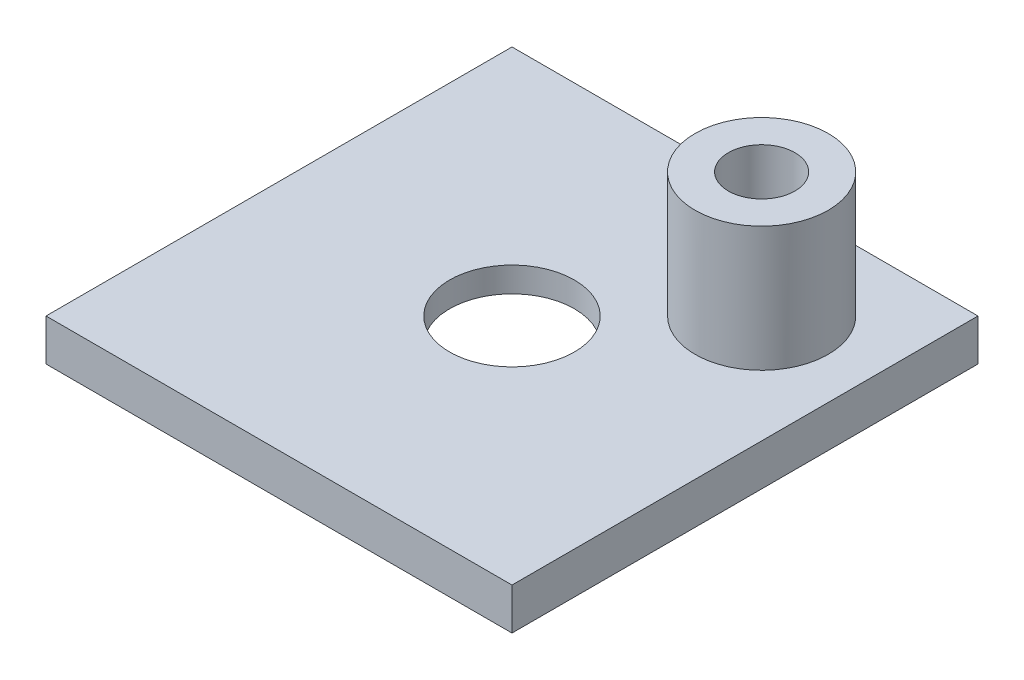
ISO-10303-21;
HEADER;
FILE_DESCRIPTION(('STEP AP214'),'2;1');
FILE_NAME('part.step','',(''),(''),'','','');
FILE_SCHEMA(('AUTOMOTIVE_DESIGN { 1 0 10303 214 1 1 1 1 }'));
ENDSEC;
DATA;
#1=APPLICATION_CONTEXT('core data for automotive mechanical design processes');
#2=APPLICATION_PROTOCOL_DEFINITION('international standard','automotive_design',2000,#1);
#3=PRODUCT_CONTEXT('',#1,'mechanical');
#4=PRODUCT('Part','Part','',(#3));
#5=PRODUCT_RELATED_PRODUCT_CATEGORY('part','',(#4));
#6=PRODUCT_DEFINITION_FORMATION('','',#4);
#7=PRODUCT_DEFINITION_CONTEXT('part definition',#1,'design');
#8=PRODUCT_DEFINITION('design','',#6,#7);
#9=PRODUCT_DEFINITION_SHAPE('','',#8);
#10=(LENGTH_UNIT() NAMED_UNIT(*) SI_UNIT(.MILLI.,.METRE.));
#11=(NAMED_UNIT(*) PLANE_ANGLE_UNIT() SI_UNIT($,.RADIAN.));
#12=(NAMED_UNIT(*) SI_UNIT($,.STERADIAN.) SOLID_ANGLE_UNIT());
#13=UNCERTAINTY_MEASURE_WITH_UNIT(LENGTH_MEASURE(1.E-05),#10,'distance_accuracy_value','');
#14=(GEOMETRIC_REPRESENTATION_CONTEXT(3) GLOBAL_UNCERTAINTY_ASSIGNED_CONTEXT((#13)) GLOBAL_UNIT_ASSIGNED_CONTEXT((#10,
#11,#12)) REPRESENTATION_CONTEXT('',''));
#15=CARTESIAN_POINT('',(0.,0.,0.));
#16=DIRECTION('',(0.,0.,1.));
#17=DIRECTION('',(1.,0.,0.));
#18=AXIS2_PLACEMENT_3D('',#15,#16,#17);
#19=CARTESIAN_POINT('',(28.,5.,28.));
#20=DIRECTION('',(-1.,0.,0.));
#21=DIRECTION('',(0.,0.,1.));
#22=AXIS2_PLACEMENT_3D('',#19,#20,#21);
#23=PLANE('',#22);
#24=DIRECTION('',(0.,0.,-1.));
#25=VECTOR('',#24,1.);
#26=CARTESIAN_POINT('',(28.,0.,28.));
#27=LINE('',#26,#25);
#28=CARTESIAN_POINT('',(28.,0.,28.));
#29=VERTEX_POINT('',#28);
#30=CARTESIAN_POINT('',(28.,0.,-28.));
#31=VERTEX_POINT('',#30);
#32=EDGE_CURVE('E111',#29,#31,#27,.T.);
#33=ORIENTED_EDGE('',*,*,#32,.T.);
#34=DIRECTION('',(0.,-1.,0.));
#35=VECTOR('',#34,1.);
#36=CARTESIAN_POINT('',(28.,5.,-28.));
#37=LINE('',#36,#35);
#38=CARTESIAN_POINT('',(28.,5.,-28.));
#39=VERTEX_POINT('',#38);
#40=EDGE_CURVE('E49',#39,#31,#37,.T.);
#41=ORIENTED_EDGE('',*,*,#40,.F.);
#42=DIRECTION('',(0.,0.,-1.));
#43=VECTOR('',#42,1.);
#44=CARTESIAN_POINT('',(28.,5.,28.));
#45=LINE('',#44,#43);
#46=CARTESIAN_POINT('',(28.,5.,28.));
#47=VERTEX_POINT('',#46);
#48=EDGE_CURVE('E93',#47,#39,#45,.T.);
#49=ORIENTED_EDGE('',*,*,#48,.F.);
#50=DIRECTION('',(0.,-1.,0.));
#51=VECTOR('',#50,1.);
#52=CARTESIAN_POINT('',(28.,5.,28.));
#53=LINE('',#52,#51);
#54=EDGE_CURVE('E107',#47,#29,#53,.T.);
#55=ORIENTED_EDGE('',*,*,#54,.T.);
#56=EDGE_LOOP('',(#33,#41,#49,#55));
#57=FACE_BOUND('',#56,.T.);
#58=ADVANCED_FACE('F39',(#57),#23,.F.);
#59=CARTESIAN_POINT('',(-28.,5.,-28.));
#60=DIRECTION('',(0.,0.,1.));
#61=DIRECTION('',(1.,0.,0.));
#62=AXIS2_PLACEMENT_3D('',#59,#60,#61);
#63=PLANE('',#62);
#64=DIRECTION('',(-1.,0.,0.));
#65=VECTOR('',#64,1.);
#66=CARTESIAN_POINT('',(-28.,0.,-28.));
#67=LINE('',#66,#65);
#68=CARTESIAN_POINT('',(-28.,0.,-28.));
#69=VERTEX_POINT('',#68);
#70=EDGE_CURVE('E99',#31,#69,#67,.T.);
#71=ORIENTED_EDGE('',*,*,#70,.T.);
#72=DIRECTION('',(0.,-1.,0.));
#73=VECTOR('',#72,1.);
#74=CARTESIAN_POINT('',(-28.,5.,-28.));
#75=LINE('',#74,#73);
#76=CARTESIAN_POINT('',(-28.,5.,-28.));
#77=VERTEX_POINT('',#76);
#78=EDGE_CURVE('E97',#77,#69,#75,.T.);
#79=ORIENTED_EDGE('',*,*,#78,.F.);
#80=DIRECTION('',(-1.,0.,0.));
#81=VECTOR('',#80,1.);
#82=CARTESIAN_POINT('',(-28.,5.,-28.));
#83=LINE('',#82,#81);
#84=EDGE_CURVE('E88',#39,#77,#83,.T.);
#85=ORIENTED_EDGE('',*,*,#84,.F.);
#86=ORIENTED_EDGE('',*,*,#40,.T.);
#87=EDGE_LOOP('',(#71,#79,#85,#86));
#88=FACE_BOUND('',#87,.T.);
#89=ADVANCED_FACE('F98',(#88),#63,.F.);
#90=CARTESIAN_POINT('',(-28.,5.,28.));
#91=DIRECTION('',(1.,0.,0.));
#92=DIRECTION('',(0.,0.,-1.));
#93=AXIS2_PLACEMENT_3D('',#90,#91,#92);
#94=PLANE('',#93);
#95=DIRECTION('',(0.,0.,1.));
#96=VECTOR('',#95,1.);
#97=CARTESIAN_POINT('',(-28.,0.,28.));
#98=LINE('',#97,#96);
#99=CARTESIAN_POINT('',(-28.,0.,28.));
#100=VERTEX_POINT('',#99);
#101=EDGE_CURVE('E74',#69,#100,#98,.T.);
#102=ORIENTED_EDGE('',*,*,#101,.T.);
#103=DIRECTION('',(0.,-1.,0.));
#104=VECTOR('',#103,1.);
#105=CARTESIAN_POINT('',(-28.,5.,28.));
#106=LINE('',#105,#104);
#107=CARTESIAN_POINT('',(-28.,5.,28.));
#108=VERTEX_POINT('',#107);
#109=EDGE_CURVE('E101',#108,#100,#106,.T.);
#110=ORIENTED_EDGE('',*,*,#109,.F.);
#111=DIRECTION('',(0.,0.,1.));
#112=VECTOR('',#111,1.);
#113=CARTESIAN_POINT('',(-28.,5.,28.));
#114=LINE('',#113,#112);
#115=EDGE_CURVE('E91',#77,#108,#114,.T.);
#116=ORIENTED_EDGE('',*,*,#115,.F.);
#117=ORIENTED_EDGE('',*,*,#78,.T.);
#118=EDGE_LOOP('',(#102,#110,#116,#117));
#119=FACE_BOUND('',#118,.T.);
#120=ADVANCED_FACE('F103',(#119),#94,.F.);
#121=CARTESIAN_POINT('',(-28.,5.,28.));
#122=DIRECTION('',(0.,0.,-1.));
#123=DIRECTION('',(-1.,0.,0.));
#124=AXIS2_PLACEMENT_3D('',#121,#122,#123);
#125=PLANE('',#124);
#126=DIRECTION('',(1.,0.,0.));
#127=VECTOR('',#126,1.);
#128=CARTESIAN_POINT('',(-28.,0.,28.));
#129=LINE('',#128,#127);
#130=EDGE_CURVE('E80',#100,#29,#129,.T.);
#131=ORIENTED_EDGE('',*,*,#130,.T.);
#132=ORIENTED_EDGE('',*,*,#54,.F.);
#133=DIRECTION('',(1.,0.,0.));
#134=VECTOR('',#133,1.);
#135=CARTESIAN_POINT('',(-28.,5.,28.));
#136=LINE('',#135,#134);
#137=EDGE_CURVE('E57',#108,#47,#136,.T.);
#138=ORIENTED_EDGE('',*,*,#137,.F.);
#139=ORIENTED_EDGE('',*,*,#109,.T.);
#140=EDGE_LOOP('',(#131,#132,#138,#139));
#141=FACE_BOUND('',#140,.T.);
#142=ADVANCED_FACE('F142',(#141),#125,.F.);
#143=CARTESIAN_POINT('',(0.,5.,0.));
#144=DIRECTION('',(0.,-1.,0.));
#145=DIRECTION('',(0.,0.,-1.));
#146=AXIS2_PLACEMENT_3D('',#143,#144,#145);
#147=PLANE('',#146);
#148=CARTESIAN_POINT('',(0.,5.,0.));
#149=DIRECTION('',(0.,-1.,0.));
#150=DIRECTION('',(0.,0.,-1.));
#151=AXIS2_PLACEMENT_3D('',#148,#149,#150);
#152=CIRCLE('',#151,7.5);
#153=CARTESIAN_POINT('',(0.,5.,-7.5));
#154=VERTEX_POINT('',#153);
#155=EDGE_CURVE('E237',#154,#154,#152,.T.);
#156=ORIENTED_EDGE('',*,*,#155,.T.);
#157=EDGE_LOOP('',(#156));
#158=FACE_BOUND('',#157,.T.);
#159=CARTESIAN_POINT('',(15.,5.,-15.));
#160=DIRECTION('',(0.,-1.,0.));
#161=DIRECTION('',(0.,0.,-1.));
#162=AXIS2_PLACEMENT_3D('',#159,#160,#161);
#163=CIRCLE('',#162,8.);
#164=CARTESIAN_POINT('',(15.,5.,-23.));
#165=VERTEX_POINT('',#164);
#166=EDGE_CURVE('E11',#165,#165,#163,.F.);
#167=ORIENTED_EDGE('',*,*,#166,.F.);
#168=EDGE_LOOP('',(#167));
#169=FACE_BOUND('',#168,.T.);
#170=ORIENTED_EDGE('',*,*,#48,.T.);
#171=ORIENTED_EDGE('',*,*,#84,.T.);
#172=ORIENTED_EDGE('',*,*,#115,.T.);
#173=ORIENTED_EDGE('',*,*,#137,.T.);
#174=EDGE_LOOP('',(#170,#171,#172,#173));
#175=FACE_BOUND('',#174,.T.);
#176=ADVANCED_FACE('F89',(#158,#169,#175),#147,.F.);
#177=CARTESIAN_POINT('',(0.,0.,0.));
#178=DIRECTION('',(0.,-1.,0.));
#179=DIRECTION('',(0.,0.,-1.));
#180=AXIS2_PLACEMENT_3D('',#177,#178,#179);
#181=PLANE('',#180);
#182=CARTESIAN_POINT('',(0.,0.,0.));
#183=DIRECTION('',(0.,-1.,0.));
#184=DIRECTION('',(0.,0.,-1.));
#185=AXIS2_PLACEMENT_3D('',#182,#183,#184);
#186=CIRCLE('',#185,19.);
#187=CARTESIAN_POINT('',(0.,0.,-19.));
#188=VERTEX_POINT('',#187);
#189=EDGE_CURVE('E235',#188,#188,#186,.T.);
#190=ORIENTED_EDGE('',*,*,#189,.F.);
#191=EDGE_LOOP('',(#190));
#192=FACE_BOUND('',#191,.T.);
#193=ORIENTED_EDGE('',*,*,#32,.F.);
#194=ORIENTED_EDGE('',*,*,#130,.F.);
#195=ORIENTED_EDGE('',*,*,#101,.F.);
#196=ORIENTED_EDGE('',*,*,#70,.F.);
#197=EDGE_LOOP('',(#193,#194,#195,#196));
#198=FACE_BOUND('',#197,.T.);
#199=ADVANCED_FACE('F130',(#192,#198),#181,.T.);
#200=CARTESIAN_POINT('',(15.,20.,-15.));
#201=DIRECTION('',(0.,-1.,0.));
#202=DIRECTION('',(0.,0.,-1.));
#203=AXIS2_PLACEMENT_3D('',#200,#201,#202);
#204=CYLINDRICAL_SURFACE('',#203,8.);
#205=CARTESIAN_POINT('',(15.,20.,-15.));
#206=DIRECTION('',(0.,1.,0.));
#207=DIRECTION('',(0.,0.,1.));
#208=AXIS2_PLACEMENT_3D('',#205,#206,#207);
#209=CIRCLE('',#208,8.);
#210=CARTESIAN_POINT('',(15.,20.,-7.));
#211=VERTEX_POINT('',#210);
#212=EDGE_CURVE('E115',#211,#211,#209,.T.);
#213=ORIENTED_EDGE('',*,*,#212,.F.);
#214=EDGE_LOOP('',(#213));
#215=FACE_BOUND('',#214,.T.);
#216=ORIENTED_EDGE('',*,*,#166,.T.);
#217=EDGE_LOOP('',(#216));
#218=FACE_BOUND('',#217,.T.);
#219=ADVANCED_FACE('F132',(#215,#218),#204,.T.);
#220=CARTESIAN_POINT('',(15.,20.,-15.));
#221=DIRECTION('',(0.,1.,0.));
#222=DIRECTION('',(0.,0.,1.));
#223=AXIS2_PLACEMENT_3D('',#220,#221,#222);
#224=PLANE('',#223);
#225=CARTESIAN_POINT('',(15.,20.,-15.));
#226=DIRECTION('',(0.,1.,0.));
#227=DIRECTION('',(0.,0.,1.));
#228=AXIS2_PLACEMENT_3D('',#225,#226,#227);
#229=CIRCLE('',#228,4.);
#230=CARTESIAN_POINT('',(15.,20.,-11.));
#231=VERTEX_POINT('',#230);
#232=EDGE_CURVE('E258',#231,#231,#229,.T.);
#233=ORIENTED_EDGE('',*,*,#232,.F.);
#234=EDGE_LOOP('',(#233));
#235=FACE_BOUND('',#234,.T.);
#236=ORIENTED_EDGE('',*,*,#212,.T.);
#237=EDGE_LOOP('',(#236));
#238=FACE_BOUND('',#237,.T.);
#239=ADVANCED_FACE('F139',(#235,#238),#224,.T.);
#240=CARTESIAN_POINT('',(0.,2.,0.));
#241=DIRECTION('',(0.,-1.,0.));
#242=DIRECTION('',(0.,0.,-1.));
#243=AXIS2_PLACEMENT_3D('',#240,#241,#242);
#244=CYLINDRICAL_SURFACE('',#243,19.);
#245=CARTESIAN_POINT('',(0.,2.,0.));
#246=DIRECTION('',(0.,-1.,0.));
#247=DIRECTION('',(0.,0.,-1.));
#248=AXIS2_PLACEMENT_3D('',#245,#246,#247);
#249=CIRCLE('',#248,19.);
#250=CARTESIAN_POINT('',(0.,2.,-19.));
#251=VERTEX_POINT('',#250);
#252=EDGE_CURVE('E233',#251,#251,#249,.T.);
#253=ORIENTED_EDGE('',*,*,#252,.F.);
#254=EDGE_LOOP('',(#253));
#255=FACE_BOUND('',#254,.T.);
#256=ORIENTED_EDGE('',*,*,#189,.T.);
#257=EDGE_LOOP('',(#256));
#258=FACE_BOUND('',#257,.T.);
#259=ADVANCED_FACE('F172',(#255,#258),#244,.F.);
#260=CARTESIAN_POINT('',(0.,2.,0.));
#261=DIRECTION('',(0.,-1.,0.));
#262=DIRECTION('',(0.,0.,-1.));
#263=AXIS2_PLACEMENT_3D('',#260,#261,#262);
#264=PLANE('',#263);
#265=CARTESIAN_POINT('',(0.,2.,0.));
#266=DIRECTION('',(0.,-1.,0.));
#267=DIRECTION('',(0.,0.,-1.));
#268=AXIS2_PLACEMENT_3D('',#265,#266,#267);
#269=CIRCLE('',#268,7.5);
#270=CARTESIAN_POINT('',(0.,2.,-7.5));
#271=VERTEX_POINT('',#270);
#272=EDGE_CURVE('E42',#271,#271,#269,.T.);
#273=ORIENTED_EDGE('',*,*,#272,.F.);
#274=EDGE_LOOP('',(#273));
#275=FACE_BOUND('',#274,.T.);
#276=ORIENTED_EDGE('',*,*,#252,.T.);
#277=EDGE_LOOP('',(#276));
#278=FACE_BOUND('',#277,.T.);
#279=ADVANCED_FACE('F176',(#275,#278),#264,.T.);
#280=CARTESIAN_POINT('',(0.,20.,0.));
#281=DIRECTION('',(0.,-1.,0.));
#282=DIRECTION('',(0.,0.,-1.));
#283=AXIS2_PLACEMENT_3D('',#280,#281,#282);
#284=CYLINDRICAL_SURFACE('',#283,7.5);
#285=ORIENTED_EDGE('',*,*,#272,.T.);
#286=EDGE_LOOP('',(#285));
#287=FACE_BOUND('',#286,.T.);
#288=ORIENTED_EDGE('',*,*,#155,.F.);
#289=EDGE_LOOP('',(#288));
#290=FACE_BOUND('',#289,.T.);
#291=ADVANCED_FACE('F181',(#287,#290),#284,.F.);
#292=CARTESIAN_POINT('',(0.,5.,0.));
#293=DIRECTION('',(0.,-1.,0.));
#294=DIRECTION('',(0.,0.,-1.));
#295=AXIS2_PLACEMENT_3D('',#292,#293,#294);
#296=PLANE('',#295);
#297=CARTESIAN_POINT('',(15.,5.,-15.));
#298=DIRECTION('',(0.,-1.,0.));
#299=DIRECTION('',(0.,0.,-1.));
#300=AXIS2_PLACEMENT_3D('',#297,#298,#299);
#301=CIRCLE('',#300,4.);
#302=CARTESIAN_POINT('',(15.,5.,-19.));
#303=VERTEX_POINT('',#302);
#304=EDGE_CURVE('E254',#303,#303,#301,.F.);
#305=ORIENTED_EDGE('',*,*,#304,.T.);
#306=EDGE_LOOP('',(#305));
#307=FACE_BOUND('',#306,.T.);
#308=ADVANCED_FACE('F191',(#307),#296,.F.);
#309=CARTESIAN_POINT('',(15.,-6.31370849898476,-15.));
#310=DIRECTION('',(0.,1.,0.));
#311=DIRECTION('',(0.,0.,1.));
#312=AXIS2_PLACEMENT_3D('',#309,#310,#311);
#313=CYLINDRICAL_SURFACE('',#312,4.);
#314=ORIENTED_EDGE('',*,*,#232,.T.);
#315=EDGE_LOOP('',(#314));
#316=FACE_BOUND('',#315,.T.);
#317=ORIENTED_EDGE('',*,*,#304,.F.);
#318=EDGE_LOOP('',(#317));
#319=FACE_BOUND('',#318,.T.);
#320=ADVANCED_FACE('F211',(#316,#319),#313,.F.);
#321=CLOSED_SHELL('',(#58,#89,#120,#142,#176,#199,#219,#239,#259,#279,#291,#308,#320));
#322=MANIFOLD_SOLID_BREP('B2',#321);
#323=ADVANCED_BREP_SHAPE_REPRESENTATION('',(#18,#322),#14);
#324=SHAPE_DEFINITION_REPRESENTATION(#9,#323);
ENDSEC;
END-ISO-10303-21;
